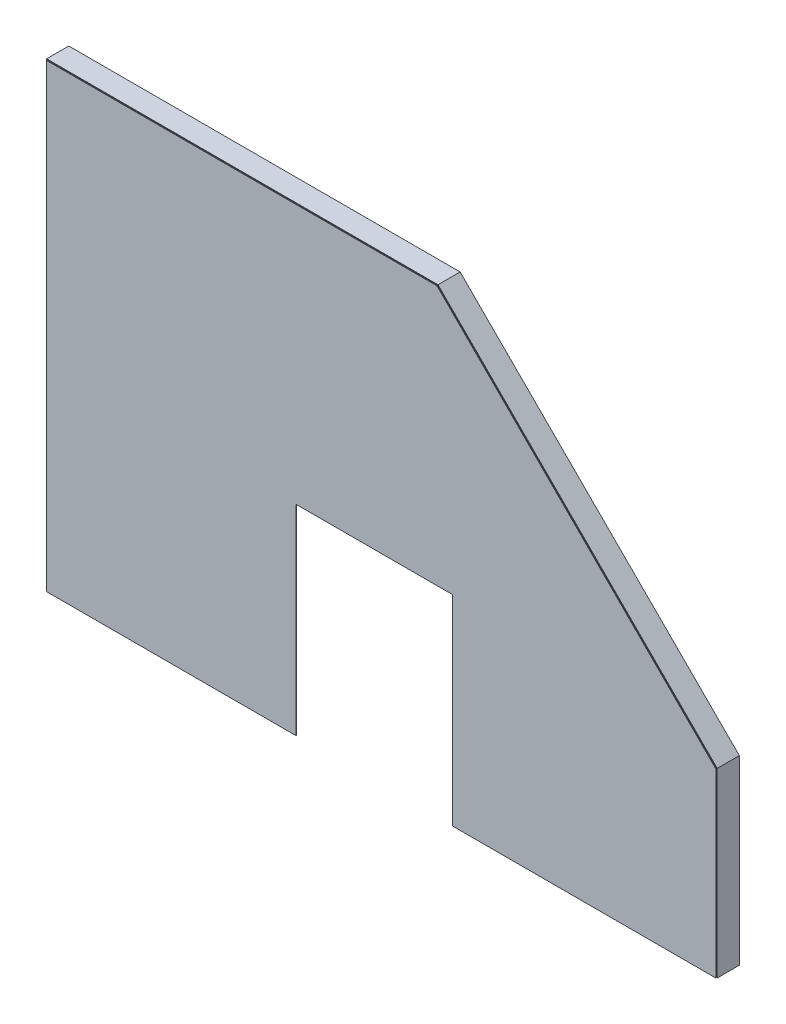
ISO-10303-21;
HEADER;
FILE_DESCRIPTION(('STEP AP214'),'2;1');
FILE_NAME('part.step','',(''),(''),'','','');
FILE_SCHEMA(('AUTOMOTIVE_DESIGN { 1 0 10303 214 1 1 1 1 }'));
ENDSEC;
DATA;
#1=APPLICATION_CONTEXT('core data for automotive mechanical design processes');
#2=APPLICATION_PROTOCOL_DEFINITION('international standard','automotive_design',2000,#1);
#3=PRODUCT_CONTEXT('',#1,'mechanical');
#4=PRODUCT('Part','Part','',(#3));
#5=PRODUCT_RELATED_PRODUCT_CATEGORY('part','',(#4));
#6=PRODUCT_DEFINITION_FORMATION('','',#4);
#7=PRODUCT_DEFINITION_CONTEXT('part definition',#1,'design');
#8=PRODUCT_DEFINITION('design','',#6,#7);
#9=PRODUCT_DEFINITION_SHAPE('','',#8);
#10=(LENGTH_UNIT() NAMED_UNIT(*) SI_UNIT(.MILLI.,.METRE.));
#11=(NAMED_UNIT(*) PLANE_ANGLE_UNIT() SI_UNIT($,.RADIAN.));
#12=(NAMED_UNIT(*) SI_UNIT($,.STERADIAN.) SOLID_ANGLE_UNIT());
#13=UNCERTAINTY_MEASURE_WITH_UNIT(LENGTH_MEASURE(1.E-05),#10,'distance_accuracy_value','');
#14=(GEOMETRIC_REPRESENTATION_CONTEXT(3) GLOBAL_UNCERTAINTY_ASSIGNED_CONTEXT((#13)) GLOBAL_UNIT_ASSIGNED_CONTEXT((#10,
#11,#12)) REPRESENTATION_CONTEXT('',''));
#15=CARTESIAN_POINT('',(0.,0.,0.));
#16=DIRECTION('',(0.,0.,1.));
#17=DIRECTION('',(1.,0.,0.));
#18=AXIS2_PLACEMENT_3D('',#15,#16,#17);
#19=CARTESIAN_POINT('',(0.,0.,-25.4));
#20=DIRECTION('',(-1.,0.,0.));
#21=DIRECTION('',(0.,-1.,0.));
#22=AXIS2_PLACEMENT_3D('',#19,#20,#21);
#23=PLANE('',#22);
#24=DIRECTION('',(0.,-1.,0.));
#25=VECTOR('',#24,1.);
#26=CARTESIAN_POINT('',(0.,0.,0.));
#27=LINE('',#26,#25);
#28=CARTESIAN_POINT('',(0.,528.,0.));
#29=VERTEX_POINT('',#28);
#30=CARTESIAN_POINT('',(0.,0.,0.));
#31=VERTEX_POINT('',#30);
#32=EDGE_CURVE('E174',#29,#31,#27,.T.);
#33=ORIENTED_EDGE('',*,*,#32,.T.);
#34=DIRECTION('',(0.,0.,1.));
#35=VECTOR('',#34,1.);
#36=CARTESIAN_POINT('',(0.,0.,-25.4));
#37=LINE('',#36,#35);
#38=CARTESIAN_POINT('',(0.,0.,-25.4));
#39=VERTEX_POINT('',#38);
#40=EDGE_CURVE('E12',#39,#31,#37,.T.);
#41=ORIENTED_EDGE('',*,*,#40,.F.);
#42=DIRECTION('',(0.,-1.,0.));
#43=VECTOR('',#42,1.);
#44=CARTESIAN_POINT('',(0.,0.,-25.4));
#45=LINE('',#44,#43);
#46=CARTESIAN_POINT('',(0.,528.,-25.4));
#47=VERTEX_POINT('',#46);
#48=EDGE_CURVE('E202',#47,#39,#45,.T.);
#49=ORIENTED_EDGE('',*,*,#48,.F.);
#50=DIRECTION('',(0.,0.,1.));
#51=VECTOR('',#50,1.);
#52=CARTESIAN_POINT('',(0.,528.,-25.4));
#53=LINE('',#52,#51);
#54=EDGE_CURVE('E170',#47,#29,#53,.T.);
#55=ORIENTED_EDGE('',*,*,#54,.T.);
#56=EDGE_LOOP('',(#33,#41,#49,#55));
#57=FACE_BOUND('',#56,.T.);
#58=ADVANCED_FACE('F60',(#57),#23,.F.);
#59=CARTESIAN_POINT('',(-0.83566,0.,-25.4));
#60=DIRECTION('',(0.,1.,0.));
#61=DIRECTION('',(0.,0.,1.));
#62=AXIS2_PLACEMENT_3D('',#59,#60,#61);
#63=PLANE('',#62);
#64=DIRECTION('',(-1.,0.,0.));
#65=VECTOR('',#64,1.);
#66=CARTESIAN_POINT('',(-0.83566,0.,0.));
#67=LINE('',#66,#65);
#68=CARTESIAN_POINT('',(-0.83566,0.,0.));
#69=VERTEX_POINT('',#68);
#70=EDGE_CURVE('E178',#31,#69,#67,.T.);
#71=ORIENTED_EDGE('',*,*,#70,.T.);
#72=DIRECTION('',(0.,0.,1.));
#73=VECTOR('',#72,1.);
#74=CARTESIAN_POINT('',(-0.83566,0.,-25.4));
#75=LINE('',#74,#73);
#76=CARTESIAN_POINT('',(-0.83566,0.,-25.4));
#77=VERTEX_POINT('',#76);
#78=EDGE_CURVE('E69',#77,#69,#75,.T.);
#79=ORIENTED_EDGE('',*,*,#78,.F.);
#80=DIRECTION('',(-1.,0.,0.));
#81=VECTOR('',#80,1.);
#82=CARTESIAN_POINT('',(-0.83566,0.,-25.4));
#83=LINE('',#82,#81);
#84=EDGE_CURVE('E126',#39,#77,#83,.T.);
#85=ORIENTED_EDGE('',*,*,#84,.F.);
#86=ORIENTED_EDGE('',*,*,#40,.T.);
#87=EDGE_LOOP('',(#71,#79,#85,#86));
#88=FACE_BOUND('',#87,.T.);
#89=ADVANCED_FACE('F272',(#88),#63,.F.);
#90=CARTESIAN_POINT('',(-0.83566,0.,-25.4));
#91=DIRECTION('',(1.,0.,0.));
#92=DIRECTION('',(0.,0.,-1.));
#93=AXIS2_PLACEMENT_3D('',#90,#91,#92);
#94=PLANE('',#93);
#95=DIRECTION('',(0.,1.,0.));
#96=VECTOR('',#95,1.);
#97=CARTESIAN_POINT('',(-0.83566,0.,0.));
#98=LINE('',#97,#96);
#99=CARTESIAN_POINT('',(-0.83566,528.83566,0.));
#100=VERTEX_POINT('',#99);
#101=EDGE_CURVE('E181',#69,#100,#98,.T.);
#102=ORIENTED_EDGE('',*,*,#101,.T.);
#103=DIRECTION('',(0.,0.,1.));
#104=VECTOR('',#103,1.);
#105=CARTESIAN_POINT('',(-0.83566,528.83566,-25.4));
#106=LINE('',#105,#104);
#107=CARTESIAN_POINT('',(-0.83566,528.83566,-25.4));
#108=VERTEX_POINT('',#107);
#109=EDGE_CURVE('E221',#108,#100,#106,.T.);
#110=ORIENTED_EDGE('',*,*,#109,.F.);
#111=DIRECTION('',(0.,1.,0.));
#112=VECTOR('',#111,1.);
#113=CARTESIAN_POINT('',(-0.83566,0.,-25.4));
#114=LINE('',#113,#112);
#115=EDGE_CURVE('E232',#77,#108,#114,.T.);
#116=ORIENTED_EDGE('',*,*,#115,.F.);
#117=ORIENTED_EDGE('',*,*,#78,.T.);
#118=EDGE_LOOP('',(#102,#110,#116,#117));
#119=FACE_BOUND('',#118,.T.);
#120=ADVANCED_FACE('F230',(#119),#94,.F.);
#121=CARTESIAN_POINT('',(-0.83566,528.83566,-25.4));
#122=DIRECTION('',(0.,-1.,0.));
#123=DIRECTION('',(0.,0.,-1.));
#124=AXIS2_PLACEMENT_3D('',#121,#122,#123);
#125=PLANE('',#124);
#126=DIRECTION('',(1.,0.,0.));
#127=VECTOR('',#126,1.);
#128=CARTESIAN_POINT('',(-0.83566,528.83566,0.));
#129=LINE('',#128,#127);
#130=CARTESIAN_POINT('',(448.346141705533,528.83566,0.));
#131=VERTEX_POINT('',#130);
#132=EDGE_CURVE('E184',#100,#131,#129,.T.);
#133=ORIENTED_EDGE('',*,*,#132,.T.);
#134=DIRECTION('',(0.,0.,1.));
#135=VECTOR('',#134,1.);
#136=CARTESIAN_POINT('',(448.346141705533,528.83566,-25.4));
#137=LINE('',#136,#135);
#138=CARTESIAN_POINT('',(448.346141705533,528.83566,-25.4));
#139=VERTEX_POINT('',#138);
#140=EDGE_CURVE('E217',#139,#131,#137,.T.);
#141=ORIENTED_EDGE('',*,*,#140,.F.);
#142=DIRECTION('',(1.,0.,0.));
#143=VECTOR('',#142,1.);
#144=CARTESIAN_POINT('',(-0.83566,528.83566,-25.4));
#145=LINE('',#144,#143);
#146=EDGE_CURVE('E251',#108,#139,#145,.T.);
#147=ORIENTED_EDGE('',*,*,#146,.F.);
#148=ORIENTED_EDGE('',*,*,#109,.T.);
#149=EDGE_LOOP('',(#133,#141,#147,#148));
#150=FACE_BOUND('',#149,.T.);
#151=ADVANCED_FACE('F241',(#150),#125,.F.);
#152=CARTESIAN_POINT('',(448.346141705533,528.83566,-25.4));
#153=DIRECTION('',(-0.707106781186548,-0.707106781186548,0.));
#154=DIRECTION('',(0.707106781186548,-0.707106781186548,0.));
#155=AXIS2_PLACEMENT_3D('',#152,#153,#154);
#156=PLANE('',#155);
#157=DIRECTION('',(0.707106781186548,-0.707106781186548,0.));
#158=VECTOR('',#157,1.);
#159=CARTESIAN_POINT('',(448.346141705533,528.83566,0.));
#160=LINE('',#159,#158);
#161=CARTESIAN_POINT('',(768.83566,208.346141705533,0.));
#162=VERTEX_POINT('',#161);
#163=EDGE_CURVE('E187',#131,#162,#160,.T.);
#164=ORIENTED_EDGE('',*,*,#163,.T.);
#165=DIRECTION('',(0.,0.,1.));
#166=VECTOR('',#165,1.);
#167=CARTESIAN_POINT('',(768.83566,208.346141705533,-25.4));
#168=LINE('',#167,#166);
#169=CARTESIAN_POINT('',(768.83566,208.346141705533,-25.4));
#170=VERTEX_POINT('',#169);
#171=EDGE_CURVE('E213',#170,#162,#168,.T.);
#172=ORIENTED_EDGE('',*,*,#171,.F.);
#173=DIRECTION('',(0.707106781186548,-0.707106781186548,0.));
#174=VECTOR('',#173,1.);
#175=CARTESIAN_POINT('',(448.346141705533,528.83566,-25.4));
#176=LINE('',#175,#174);
#177=EDGE_CURVE('E247',#139,#170,#176,.T.);
#178=ORIENTED_EDGE('',*,*,#177,.F.);
#179=ORIENTED_EDGE('',*,*,#140,.T.);
#180=EDGE_LOOP('',(#164,#172,#178,#179));
#181=FACE_BOUND('',#180,.T.);
#182=ADVANCED_FACE('F245',(#181),#156,.F.);
#183=CARTESIAN_POINT('',(768.83566,208.346141705533,-25.4));
#184=DIRECTION('',(-1.,0.,0.));
#185=DIRECTION('',(0.,0.,1.));
#186=AXIS2_PLACEMENT_3D('',#183,#184,#185);
#187=PLANE('',#186);
#188=DIRECTION('',(0.,-1.,0.));
#189=VECTOR('',#188,1.);
#190=CARTESIAN_POINT('',(768.83566,208.346141705533,0.));
#191=LINE('',#190,#189);
#192=CARTESIAN_POINT('',(768.83566,0.,0.));
#193=VERTEX_POINT('',#192);
#194=EDGE_CURVE('E190',#162,#193,#191,.T.);
#195=ORIENTED_EDGE('',*,*,#194,.T.);
#196=DIRECTION('',(0.,0.,1.));
#197=VECTOR('',#196,1.);
#198=CARTESIAN_POINT('',(768.83566,0.,-25.4));
#199=LINE('',#198,#197);
#200=CARTESIAN_POINT('',(768.83566,0.,-25.4));
#201=VERTEX_POINT('',#200);
#202=EDGE_CURVE('E209',#201,#193,#199,.T.);
#203=ORIENTED_EDGE('',*,*,#202,.F.);
#204=DIRECTION('',(0.,-1.,0.));
#205=VECTOR('',#204,1.);
#206=CARTESIAN_POINT('',(768.83566,208.346141705533,-25.4));
#207=LINE('',#206,#205);
#208=EDGE_CURVE('E250',#170,#201,#207,.T.);
#209=ORIENTED_EDGE('',*,*,#208,.F.);
#210=ORIENTED_EDGE('',*,*,#171,.T.);
#211=EDGE_LOOP('',(#195,#203,#209,#210));
#212=FACE_BOUND('',#211,.T.);
#213=ADVANCED_FACE('F284',(#212),#187,.F.);
#214=CARTESIAN_POINT('',(768.,0.,-25.4));
#215=DIRECTION('',(0.,1.,0.));
#216=DIRECTION('',(0.,0.,1.));
#217=AXIS2_PLACEMENT_3D('',#214,#215,#216);
#218=PLANE('',#217);
#219=DIRECTION('',(-1.,0.,0.));
#220=VECTOR('',#219,1.);
#221=CARTESIAN_POINT('',(768.,0.,0.));
#222=LINE('',#221,#220);
#223=CARTESIAN_POINT('',(768.,0.,0.));
#224=VERTEX_POINT('',#223);
#225=EDGE_CURVE('E193',#193,#224,#222,.T.);
#226=ORIENTED_EDGE('',*,*,#225,.T.);
#227=DIRECTION('',(0.,0.,1.));
#228=VECTOR('',#227,1.);
#229=CARTESIAN_POINT('',(768.,0.,-25.4));
#230=LINE('',#229,#228);
#231=CARTESIAN_POINT('',(768.,0.,-25.4));
#232=VERTEX_POINT('',#231);
#233=EDGE_CURVE('E162',#232,#224,#230,.T.);
#234=ORIENTED_EDGE('',*,*,#233,.F.);
#235=DIRECTION('',(-1.,0.,0.));
#236=VECTOR('',#235,1.);
#237=CARTESIAN_POINT('',(768.,0.,-25.4));
#238=LINE('',#237,#236);
#239=EDGE_CURVE('E151',#201,#232,#238,.T.);
#240=ORIENTED_EDGE('',*,*,#239,.F.);
#241=ORIENTED_EDGE('',*,*,#202,.T.);
#242=EDGE_LOOP('',(#226,#234,#240,#241));
#243=FACE_BOUND('',#242,.T.);
#244=ADVANCED_FACE('F287',(#243),#218,.F.);
#245=CARTESIAN_POINT('',(768.,208.,-25.4));
#246=DIRECTION('',(1.,0.,0.));
#247=DIRECTION('',(0.,0.,-1.));
#248=AXIS2_PLACEMENT_3D('',#245,#246,#247);
#249=PLANE('',#248);
#250=DIRECTION('',(0.,1.,0.));
#251=VECTOR('',#250,1.);
#252=CARTESIAN_POINT('',(768.,208.,0.));
#253=LINE('',#252,#251);
#254=CARTESIAN_POINT('',(768.,208.,0.));
#255=VERTEX_POINT('',#254);
#256=EDGE_CURVE('E160',#224,#255,#253,.T.);
#257=ORIENTED_EDGE('',*,*,#256,.T.);
#258=DIRECTION('',(0.,0.,1.));
#259=VECTOR('',#258,1.);
#260=CARTESIAN_POINT('',(768.,208.,-25.4));
#261=LINE('',#260,#259);
#262=CARTESIAN_POINT('',(768.,208.,-25.4));
#263=VERTEX_POINT('',#262);
#264=EDGE_CURVE('E157',#263,#255,#261,.T.);
#265=ORIENTED_EDGE('',*,*,#264,.F.);
#266=DIRECTION('',(0.,1.,0.));
#267=VECTOR('',#266,1.);
#268=CARTESIAN_POINT('',(768.,208.,-25.4));
#269=LINE('',#268,#267);
#270=EDGE_CURVE('E145',#232,#263,#269,.T.);
#271=ORIENTED_EDGE('',*,*,#270,.F.);
#272=ORIENTED_EDGE('',*,*,#233,.T.);
#273=EDGE_LOOP('',(#257,#265,#271,#272));
#274=FACE_BOUND('',#273,.T.);
#275=ADVANCED_FACE('F158',(#274),#249,.F.);
#276=CARTESIAN_POINT('',(448.,528.,-25.4));
#277=DIRECTION('',(0.707106781186548,0.707106781186547,0.));
#278=DIRECTION('',(-0.707106781186547,0.707106781186548,0.));
#279=AXIS2_PLACEMENT_3D('',#276,#277,#278);
#280=PLANE('',#279);
#281=DIRECTION('',(-0.707106781186547,0.707106781186548,0.));
#282=VECTOR('',#281,1.);
#283=CARTESIAN_POINT('',(448.,528.,0.));
#284=LINE('',#283,#282);
#285=CARTESIAN_POINT('',(448.,528.,0.));
#286=VERTEX_POINT('',#285);
#287=EDGE_CURVE('E112',#255,#286,#284,.T.);
#288=ORIENTED_EDGE('',*,*,#287,.T.);
#289=DIRECTION('',(0.,0.,1.));
#290=VECTOR('',#289,1.);
#291=CARTESIAN_POINT('',(448.,528.,-25.4));
#292=LINE('',#291,#290);
#293=CARTESIAN_POINT('',(448.,528.,-25.4));
#294=VERTEX_POINT('',#293);
#295=EDGE_CURVE('E163',#294,#286,#292,.T.);
#296=ORIENTED_EDGE('',*,*,#295,.F.);
#297=DIRECTION('',(-0.707106781186547,0.707106781186548,0.));
#298=VECTOR('',#297,1.);
#299=CARTESIAN_POINT('',(448.,528.,-25.4));
#300=LINE('',#299,#298);
#301=EDGE_CURVE('E149',#263,#294,#300,.T.);
#302=ORIENTED_EDGE('',*,*,#301,.F.);
#303=ORIENTED_EDGE('',*,*,#264,.T.);
#304=EDGE_LOOP('',(#288,#296,#302,#303));
#305=FACE_BOUND('',#304,.T.);
#306=ADVANCED_FACE('F165',(#305),#280,.F.);
#307=CARTESIAN_POINT('',(0.,528.,-25.4));
#308=DIRECTION('',(0.,1.,0.));
#309=DIRECTION('',(-1.,0.,0.));
#310=AXIS2_PLACEMENT_3D('',#307,#308,#309);
#311=PLANE('',#310);
#312=DIRECTION('',(-1.,0.,0.));
#313=VECTOR('',#312,1.);
#314=CARTESIAN_POINT('',(0.,528.,0.));
#315=LINE('',#314,#313);
#316=EDGE_CURVE('E118',#286,#29,#315,.T.);
#317=ORIENTED_EDGE('',*,*,#316,.T.);
#318=ORIENTED_EDGE('',*,*,#54,.F.);
#319=DIRECTION('',(-1.,0.,0.));
#320=VECTOR('',#319,1.);
#321=CARTESIAN_POINT('',(0.,528.,-25.4));
#322=LINE('',#321,#320);
#323=EDGE_CURVE('E77',#294,#47,#322,.T.);
#324=ORIENTED_EDGE('',*,*,#323,.F.);
#325=ORIENTED_EDGE('',*,*,#295,.T.);
#326=EDGE_LOOP('',(#317,#318,#324,#325));
#327=FACE_BOUND('',#326,.T.);
#328=ADVANCED_FACE('F296',(#327),#311,.F.);
#329=CARTESIAN_POINT('',(0.,0.,-25.4));
#330=DIRECTION('',(0.,0.,-1.));
#331=DIRECTION('',(-1.,0.,0.));
#332=AXIS2_PLACEMENT_3D('',#329,#330,#331);
#333=PLANE('',#332);
#334=ORIENTED_EDGE('',*,*,#48,.T.);
#335=ORIENTED_EDGE('',*,*,#84,.T.);
#336=ORIENTED_EDGE('',*,*,#115,.T.);
#337=ORIENTED_EDGE('',*,*,#146,.T.);
#338=ORIENTED_EDGE('',*,*,#177,.T.);
#339=ORIENTED_EDGE('',*,*,#208,.T.);
#340=ORIENTED_EDGE('',*,*,#239,.T.);
#341=ORIENTED_EDGE('',*,*,#270,.T.);
#342=ORIENTED_EDGE('',*,*,#301,.T.);
#343=ORIENTED_EDGE('',*,*,#323,.T.);
#344=EDGE_LOOP('',(#334,#335,#336,#337,#338,#339,#340,#341,#342,#343));
#345=FACE_BOUND('',#344,.T.);
#346=ADVANCED_FACE('F147',(#345),#333,.T.);
#347=CARTESIAN_POINT('',(0.,0.,0.));
#348=DIRECTION('',(0.,0.,-1.));
#349=DIRECTION('',(-1.,0.,0.));
#350=AXIS2_PLACEMENT_3D('',#347,#348,#349);
#351=PLANE('',#350);
#352=ORIENTED_EDGE('',*,*,#32,.F.);
#353=ORIENTED_EDGE('',*,*,#316,.F.);
#354=ORIENTED_EDGE('',*,*,#287,.F.);
#355=ORIENTED_EDGE('',*,*,#256,.F.);
#356=ORIENTED_EDGE('',*,*,#225,.F.);
#357=ORIENTED_EDGE('',*,*,#194,.F.);
#358=ORIENTED_EDGE('',*,*,#163,.F.);
#359=ORIENTED_EDGE('',*,*,#132,.F.);
#360=ORIENTED_EDGE('',*,*,#101,.F.);
#361=ORIENTED_EDGE('',*,*,#70,.F.);
#362=EDGE_LOOP('',(#352,#353,#354,#355,#356,#357,#358,#359,#360,#361));
#363=FACE_BOUND('',#362,.T.);
#364=ADVANCED_FACE('F236',(#363),#351,.F.);
#365=CLOSED_SHELL('',(#58,#89,#120,#151,#182,#213,#244,#275,#306,#328,#346,#364));
#366=MANIFOLD_SOLID_BREP('B2',#365);
#367=CARTESIAN_POINT('',(0.,0.,0.83566));
#368=DIRECTION('',(0.,1.,0.));
#369=DIRECTION('',(0.,0.,1.));
#370=AXIS2_PLACEMENT_3D('',#367,#368,#369);
#371=PLANE('',#370);
#372=DIRECTION('',(1.,0.,0.));
#373=VECTOR('',#372,1.);
#374=CARTESIAN_POINT('',(0.,0.,0.));
#375=LINE('',#374,#373);
#376=CARTESIAN_POINT('',(0.,0.,0.));
#377=VERTEX_POINT('',#376);
#378=CARTESIAN_POINT('',(286.,0.,0.));
#379=VERTEX_POINT('',#378);
#380=EDGE_CURVE('E530',#377,#379,#375,.T.);
#381=ORIENTED_EDGE('',*,*,#380,.T.);
#382=DIRECTION('',(0.,0.,1.));
#383=VECTOR('',#382,1.);
#384=CARTESIAN_POINT('',(286.,0.,-89.16434));
#385=LINE('',#384,#383);
#386=CARTESIAN_POINT('',(286.,0.,0.83566));
#387=VERTEX_POINT('',#386);
#388=EDGE_CURVE('E589',#379,#387,#385,.T.);
#389=ORIENTED_EDGE('',*,*,#388,.T.);
#390=DIRECTION('',(1.,0.,0.));
#391=VECTOR('',#390,1.);
#392=CARTESIAN_POINT('',(0.,0.,0.83566));
#393=LINE('',#392,#391);
#394=CARTESIAN_POINT('',(0.,0.,0.83566));
#395=VERTEX_POINT('',#394);
#396=EDGE_CURVE('E481',#395,#387,#393,.T.);
#397=ORIENTED_EDGE('',*,*,#396,.F.);
#398=DIRECTION('',(0.,0.,-1.));
#399=VECTOR('',#398,1.);
#400=CARTESIAN_POINT('',(0.,0.,0.83566));
#401=LINE('',#400,#399);
#402=EDGE_CURVE('E548',#395,#377,#401,.T.);
#403=ORIENTED_EDGE('',*,*,#402,.T.);
#404=EDGE_LOOP('',(#381,#389,#397,#403));
#405=FACE_BOUND('',#404,.T.);
#406=ADVANCED_FACE('F423',(#405),#371,.F.);
#407=CARTESIAN_POINT('',(0.,528.,0.83566));
#408=DIRECTION('',(1.,0.,0.));
#409=DIRECTION('',(0.,1.,0.));
#410=AXIS2_PLACEMENT_3D('',#407,#408,#409);
#411=PLANE('',#410);
#412=DIRECTION('',(0.,-1.,0.));
#413=VECTOR('',#412,1.);
#414=CARTESIAN_POINT('',(0.,528.,0.));
#415=LINE('',#414,#413);
#416=CARTESIAN_POINT('',(0.,528.,0.));
#417=VERTEX_POINT('',#416);
#418=EDGE_CURVE('E524',#417,#377,#415,.T.);
#419=ORIENTED_EDGE('',*,*,#418,.T.);
#420=ORIENTED_EDGE('',*,*,#402,.F.);
#421=DIRECTION('',(0.,-1.,0.));
#422=VECTOR('',#421,1.);
#423=CARTESIAN_POINT('',(0.,528.,0.83566));
#424=LINE('',#423,#422);
#425=CARTESIAN_POINT('',(0.,528.,0.83566));
#426=VERTEX_POINT('',#425);
#427=EDGE_CURVE('E541',#426,#395,#424,.T.);
#428=ORIENTED_EDGE('',*,*,#427,.F.);
#429=DIRECTION('',(0.,0.,-1.));
#430=VECTOR('',#429,1.);
#431=CARTESIAN_POINT('',(0.,528.,0.83566));
#432=LINE('',#431,#430);
#433=EDGE_CURVE('E520',#426,#417,#432,.T.);
#434=ORIENTED_EDGE('',*,*,#433,.T.);
#435=EDGE_LOOP('',(#419,#420,#428,#434));
#436=FACE_BOUND('',#435,.T.);
#437=ADVANCED_FACE('F425',(#436),#411,.F.);
#438=CARTESIAN_POINT('',(466.,0.,0.83566));
#439=VERTEX_POINT('',#438);
#440=CARTESIAN_POINT('',(768.,0.,0.83566));
#441=VERTEX_POINT('',#440);
#442=EDGE_CURVE('E497',#439,#441,#393,.T.);
#443=ORIENTED_EDGE('',*,*,#442,.F.);
#444=DIRECTION('',(0.,0.,1.));
#445=VECTOR('',#444,1.);
#446=CARTESIAN_POINT('',(466.,0.,-89.16434));
#447=LINE('',#446,#445);
#448=CARTESIAN_POINT('',(466.,0.,0.));
#449=VERTEX_POINT('',#448);
#450=EDGE_CURVE('E580',#449,#439,#447,.T.);
#451=ORIENTED_EDGE('',*,*,#450,.F.);
#452=CARTESIAN_POINT('',(768.,0.,0.));
#453=VERTEX_POINT('',#452);
#454=EDGE_CURVE('E528',#449,#453,#375,.T.);
#455=ORIENTED_EDGE('',*,*,#454,.T.);
#456=DIRECTION('',(0.,0.,-1.));
#457=VECTOR('',#456,1.);
#458=CARTESIAN_POINT('',(768.,0.,0.83566));
#459=LINE('',#458,#457);
#460=EDGE_CURVE('E511',#441,#453,#459,.T.);
#461=ORIENTED_EDGE('',*,*,#460,.F.);
#462=EDGE_LOOP('',(#443,#451,#455,#461));
#463=FACE_BOUND('',#462,.T.);
#464=ADVANCED_FACE('F656',(#463),#371,.F.);
#465=CARTESIAN_POINT('',(768.,0.,0.83566));
#466=DIRECTION('',(-1.,0.,0.));
#467=DIRECTION('',(0.,0.,1.));
#468=AXIS2_PLACEMENT_3D('',#465,#466,#467);
#469=PLANE('',#468);
#470=DIRECTION('',(0.,1.,0.));
#471=VECTOR('',#470,1.);
#472=CARTESIAN_POINT('',(768.,0.,0.));
#473=LINE('',#472,#471);
#474=CARTESIAN_POINT('',(768.,208.,0.));
#475=VERTEX_POINT('',#474);
#476=EDGE_CURVE('E507',#453,#475,#473,.T.);
#477=ORIENTED_EDGE('',*,*,#476,.T.);
#478=DIRECTION('',(0.,0.,-1.));
#479=VECTOR('',#478,1.);
#480=CARTESIAN_POINT('',(768.,208.,0.83566));
#481=LINE('',#480,#479);
#482=CARTESIAN_POINT('',(768.,208.,0.83566));
#483=VERTEX_POINT('',#482);
#484=EDGE_CURVE('E504',#483,#475,#481,.T.);
#485=ORIENTED_EDGE('',*,*,#484,.F.);
#486=DIRECTION('',(0.,1.,0.));
#487=VECTOR('',#486,1.);
#488=CARTESIAN_POINT('',(768.,0.,0.83566));
#489=LINE('',#488,#487);
#490=EDGE_CURVE('E488',#441,#483,#489,.T.);
#491=ORIENTED_EDGE('',*,*,#490,.F.);
#492=ORIENTED_EDGE('',*,*,#460,.T.);
#493=EDGE_LOOP('',(#477,#485,#491,#492));
#494=FACE_BOUND('',#493,.T.);
#495=ADVANCED_FACE('F505',(#494),#469,.F.);
#496=CARTESIAN_POINT('',(768.,208.,0.83566));
#497=DIRECTION('',(-0.707106781186548,-0.707106781186547,0.));
#498=DIRECTION('',(0.707106781186547,-0.707106781186548,0.));
#499=AXIS2_PLACEMENT_3D('',#496,#497,#498);
#500=PLANE('',#499);
#501=DIRECTION('',(-0.707106781186547,0.707106781186548,0.));
#502=VECTOR('',#501,1.);
#503=CARTESIAN_POINT('',(768.,208.,0.));
#504=LINE('',#503,#502);
#505=CARTESIAN_POINT('',(448.,528.,0.));
#506=VERTEX_POINT('',#505);
#507=EDGE_CURVE('E536',#475,#506,#504,.T.);
#508=ORIENTED_EDGE('',*,*,#507,.T.);
#509=DIRECTION('',(0.,0.,-1.));
#510=VECTOR('',#509,1.);
#511=CARTESIAN_POINT('',(448.,528.,0.83566));
#512=LINE('',#511,#510);
#513=CARTESIAN_POINT('',(448.,528.,0.83566));
#514=VERTEX_POINT('',#513);
#515=EDGE_CURVE('E512',#514,#506,#512,.T.);
#516=ORIENTED_EDGE('',*,*,#515,.F.);
#517=DIRECTION('',(-0.707106781186547,0.707106781186548,0.));
#518=VECTOR('',#517,1.);
#519=CARTESIAN_POINT('',(768.,208.,0.83566));
#520=LINE('',#519,#518);
#521=EDGE_CURVE('E493',#483,#514,#520,.T.);
#522=ORIENTED_EDGE('',*,*,#521,.F.);
#523=ORIENTED_EDGE('',*,*,#484,.T.);
#524=EDGE_LOOP('',(#508,#516,#522,#523));
#525=FACE_BOUND('',#524,.T.);
#526=ADVANCED_FACE('F514',(#525),#500,.F.);
#527=CARTESIAN_POINT('',(448.,528.,0.83566));
#528=DIRECTION('',(0.,-1.,0.));
#529=DIRECTION('',(1.,0.,0.));
#530=AXIS2_PLACEMENT_3D('',#527,#528,#529);
#531=PLANE('',#530);
#532=DIRECTION('',(-1.,0.,0.));
#533=VECTOR('',#532,1.);
#534=CARTESIAN_POINT('',(448.,528.,0.));
#535=LINE('',#534,#533);
#536=EDGE_CURVE('E472',#506,#417,#535,.T.);
#537=ORIENTED_EDGE('',*,*,#536,.T.);
#538=ORIENTED_EDGE('',*,*,#433,.F.);
#539=DIRECTION('',(-1.,0.,0.));
#540=VECTOR('',#539,1.);
#541=CARTESIAN_POINT('',(448.,528.,0.83566));
#542=LINE('',#541,#540);
#543=EDGE_CURVE('E448',#514,#426,#542,.T.);
#544=ORIENTED_EDGE('',*,*,#543,.F.);
#545=ORIENTED_EDGE('',*,*,#515,.T.);
#546=EDGE_LOOP('',(#537,#538,#544,#545));
#547=FACE_BOUND('',#546,.T.);
#548=ADVANCED_FACE('F645',(#547),#531,.F.);
#549=CARTESIAN_POINT('',(0.,0.,0.83566));
#550=DIRECTION('',(0.,0.,1.));
#551=DIRECTION('',(1.,0.,0.));
#552=AXIS2_PLACEMENT_3D('',#549,#550,#551);
#553=PLANE('',#552);
#554=DIRECTION('',(0.,-1.,0.));
#555=VECTOR('',#554,1.);
#556=CARTESIAN_POINT('',(286.,90.,0.83566));
#557=LINE('',#556,#555);
#558=CARTESIAN_POINT('',(286.,230.,0.83566));
#559=VERTEX_POINT('',#558);
#560=EDGE_CURVE('E583',#559,#387,#557,.T.);
#561=ORIENTED_EDGE('',*,*,#560,.F.);
#562=DIRECTION('',(-1.,0.,0.));
#563=VECTOR('',#562,1.);
#564=CARTESIAN_POINT('',(286.,230.,0.83566));
#565=LINE('',#564,#563);
#566=CARTESIAN_POINT('',(466.,230.,0.83566));
#567=VERTEX_POINT('',#566);
#568=EDGE_CURVE('E572',#567,#559,#565,.T.);
#569=ORIENTED_EDGE('',*,*,#568,.F.);
#570=DIRECTION('',(0.,1.,0.));
#571=VECTOR('',#570,1.);
#572=CARTESIAN_POINT('',(466.,90.,0.83566));
#573=LINE('',#572,#571);
#574=EDGE_CURVE('E627',#439,#567,#573,.T.);
#575=ORIENTED_EDGE('',*,*,#574,.F.);
#576=ORIENTED_EDGE('',*,*,#442,.T.);
#577=ORIENTED_EDGE('',*,*,#490,.T.);
#578=ORIENTED_EDGE('',*,*,#521,.T.);
#579=ORIENTED_EDGE('',*,*,#543,.T.);
#580=ORIENTED_EDGE('',*,*,#427,.T.);
#581=ORIENTED_EDGE('',*,*,#396,.T.);
#582=EDGE_LOOP('',(#561,#569,#575,#576,#577,#578,#579,#580,#581));
#583=FACE_BOUND('',#582,.T.);
#584=ADVANCED_FACE('F491',(#583),#553,.T.);
#585=CARTESIAN_POINT('',(0.,0.,0.));
#586=DIRECTION('',(0.,0.,1.));
#587=DIRECTION('',(1.,0.,0.));
#588=AXIS2_PLACEMENT_3D('',#585,#586,#587);
#589=PLANE('',#588);
#590=DIRECTION('',(-1.,0.,0.));
#591=VECTOR('',#590,1.);
#592=CARTESIAN_POINT('',(0.,230.,0.));
#593=LINE('',#592,#591);
#594=CARTESIAN_POINT('',(466.,230.,0.));
#595=VERTEX_POINT('',#594);
#596=CARTESIAN_POINT('',(286.,230.,0.));
#597=VERTEX_POINT('',#596);
#598=EDGE_CURVE('E432',#595,#597,#593,.T.);
#599=ORIENTED_EDGE('',*,*,#598,.T.);
#600=DIRECTION('',(0.,-1.,0.));
#601=VECTOR('',#600,1.);
#602=CARTESIAN_POINT('',(286.,0.,0.));
#603=LINE('',#602,#601);
#604=EDGE_CURVE('E58',#597,#379,#603,.T.);
#605=ORIENTED_EDGE('',*,*,#604,.T.);
#606=ORIENTED_EDGE('',*,*,#380,.F.);
#607=ORIENTED_EDGE('',*,*,#418,.F.);
#608=ORIENTED_EDGE('',*,*,#536,.F.);
#609=ORIENTED_EDGE('',*,*,#507,.F.);
#610=ORIENTED_EDGE('',*,*,#476,.F.);
#611=ORIENTED_EDGE('',*,*,#454,.F.);
#612=DIRECTION('',(0.,1.,0.));
#613=VECTOR('',#612,1.);
#614=CARTESIAN_POINT('',(466.,0.,0.));
#615=LINE('',#614,#613);
#616=EDGE_CURVE('E551',#449,#595,#615,.T.);
#617=ORIENTED_EDGE('',*,*,#616,.T.);
#618=EDGE_LOOP('',(#599,#605,#606,#607,#608,#609,#610,#611,#617));
#619=FACE_BOUND('',#618,.T.);
#620=ADVANCED_FACE('F559',(#619),#589,.F.);
#621=CARTESIAN_POINT('',(286.,90.,-89.16434));
#622=DIRECTION('',(-1.,0.,0.));
#623=DIRECTION('',(0.,0.,1.));
#624=AXIS2_PLACEMENT_3D('',#621,#622,#623);
#625=PLANE('',#624);
#626=DIRECTION('',(0.,0.,1.));
#627=VECTOR('',#626,1.);
#628=CARTESIAN_POINT('',(286.,230.,-89.16434));
#629=LINE('',#628,#627);
#630=EDGE_CURVE('E529',#597,#559,#629,.T.);
#631=ORIENTED_EDGE('',*,*,#630,.T.);
#632=ORIENTED_EDGE('',*,*,#560,.T.);
#633=ORIENTED_EDGE('',*,*,#388,.F.);
#634=ORIENTED_EDGE('',*,*,#604,.F.);
#635=EDGE_LOOP('',(#631,#632,#633,#634));
#636=FACE_BOUND('',#635,.T.);
#637=ADVANCED_FACE('F638',(#636),#625,.F.);
#638=CARTESIAN_POINT('',(286.,230.,-89.16434));
#639=DIRECTION('',(0.,1.,0.));
#640=DIRECTION('',(0.,0.,1.));
#641=AXIS2_PLACEMENT_3D('',#638,#639,#640);
#642=PLANE('',#641);
#643=DIRECTION('',(0.,0.,1.));
#644=VECTOR('',#643,1.);
#645=CARTESIAN_POINT('',(466.,230.,-89.16434));
#646=LINE('',#645,#644);
#647=EDGE_CURVE('E439',#595,#567,#646,.T.);
#648=ORIENTED_EDGE('',*,*,#647,.T.);
#649=ORIENTED_EDGE('',*,*,#568,.T.);
#650=ORIENTED_EDGE('',*,*,#630,.F.);
#651=ORIENTED_EDGE('',*,*,#598,.F.);
#652=EDGE_LOOP('',(#648,#649,#650,#651));
#653=FACE_BOUND('',#652,.T.);
#654=ADVANCED_FACE('F566',(#653),#642,.F.);
#655=CARTESIAN_POINT('',(466.,90.,-89.16434));
#656=DIRECTION('',(1.,0.,0.));
#657=DIRECTION('',(0.,0.,-1.));
#658=AXIS2_PLACEMENT_3D('',#655,#656,#657);
#659=PLANE('',#658);
#660=ORIENTED_EDGE('',*,*,#450,.T.);
#661=ORIENTED_EDGE('',*,*,#574,.T.);
#662=ORIENTED_EDGE('',*,*,#647,.F.);
#663=ORIENTED_EDGE('',*,*,#616,.F.);
#664=EDGE_LOOP('',(#660,#661,#662,#663));
#665=FACE_BOUND('',#664,.T.);
#666=ADVANCED_FACE('F632',(#665),#659,.F.);
#667=CLOSED_SHELL('',(#406,#437,#464,#495,#526,#548,#584,#620,#637,#654,#666));
#668=MANIFOLD_SOLID_BREP('B6',#667);
#669=ADVANCED_BREP_SHAPE_REPRESENTATION('',(#18,#366,#668),#14);
#670=SHAPE_DEFINITION_REPRESENTATION(#9,#669);
ENDSEC;
END-ISO-10303-21;
